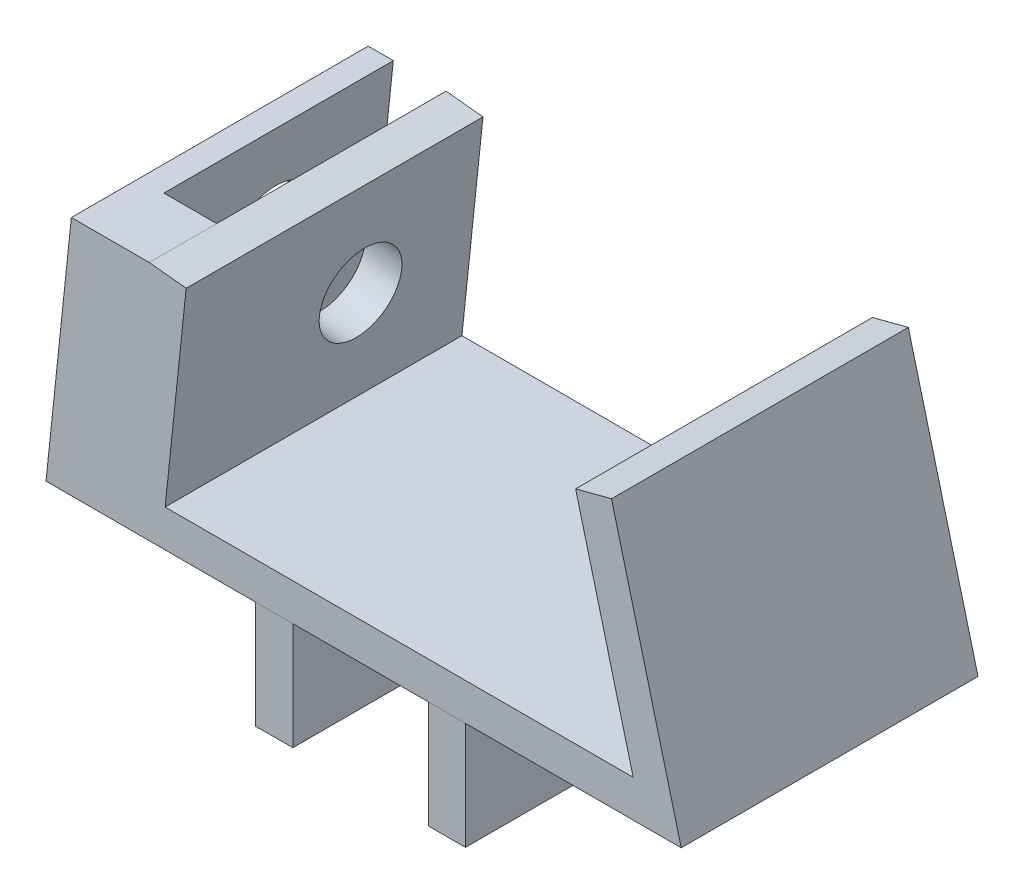
ISO-10303-21;
HEADER;
FILE_DESCRIPTION(('STEP AP214'),'2;1');
FILE_NAME('part.step','',(''),(''),'','','');
FILE_SCHEMA(('AUTOMOTIVE_DESIGN { 1 0 10303 214 1 1 1 1 }'));
ENDSEC;
DATA;
#1=APPLICATION_CONTEXT('core data for automotive mechanical design processes');
#2=APPLICATION_PROTOCOL_DEFINITION('international standard','automotive_design',2000,#1);
#3=PRODUCT_CONTEXT('',#1,'mechanical');
#4=PRODUCT('Part','Part','',(#3));
#5=PRODUCT_RELATED_PRODUCT_CATEGORY('part','',(#4));
#6=PRODUCT_DEFINITION_FORMATION('','',#4);
#7=PRODUCT_DEFINITION_CONTEXT('part definition',#1,'design');
#8=PRODUCT_DEFINITION('design','',#6,#7);
#9=PRODUCT_DEFINITION_SHAPE('','',#8);
#10=(LENGTH_UNIT() NAMED_UNIT(*) SI_UNIT(.MILLI.,.METRE.));
#11=(NAMED_UNIT(*) PLANE_ANGLE_UNIT() SI_UNIT($,.RADIAN.));
#12=(NAMED_UNIT(*) SI_UNIT($,.STERADIAN.) SOLID_ANGLE_UNIT());
#13=UNCERTAINTY_MEASURE_WITH_UNIT(LENGTH_MEASURE(1.E-05),#10,'distance_accuracy_value','');
#14=(GEOMETRIC_REPRESENTATION_CONTEXT(3) GLOBAL_UNCERTAINTY_ASSIGNED_CONTEXT((#13)) GLOBAL_UNIT_ASSIGNED_CONTEXT((#10,
#11,#12)) REPRESENTATION_CONTEXT('',''));
#15=CARTESIAN_POINT('',(0.,0.,0.));
#16=DIRECTION('',(0.,0.,1.));
#17=DIRECTION('',(1.,0.,0.));
#18=AXIS2_PLACEMENT_3D('',#15,#16,#17);
#19=CARTESIAN_POINT('',(9.48208303651341,3.49920908908251,80.));
#20=DIRECTION('',(1.,0.,0.));
#21=DIRECTION('',(0.,0.,-1.));
#22=AXIS2_PLACEMENT_3D('',#19,#20,#21);
#23=PLANE('',#22);
#24=DIRECTION('',(0.,1.,0.));
#25=VECTOR('',#24,1.);
#26=CARTESIAN_POINT('',(9.48208303651341,3.49920908908251,0.));
#27=LINE('',#26,#25);
#28=CARTESIAN_POINT('',(9.48208303651341,3.49920908908251,0.));
#29=VERTEX_POINT('',#28);
#30=CARTESIAN_POINT('',(9.48208303651341,-35.4649569839443,0.));
#31=VERTEX_POINT('',#30);
#32=EDGE_CURVE('E183',#29,#31,#27,.F.);
#33=ORIENTED_EDGE('',*,*,#32,.T.);
#34=DIRECTION('',(0.,0.,-1.));
#35=VECTOR('',#34,1.);
#36=CARTESIAN_POINT('',(9.48208303651341,-35.4649569839443,80.));
#37=LINE('',#36,#35);
#38=CARTESIAN_POINT('',(9.48208303651341,-35.4649569839443,80.));
#39=VERTEX_POINT('',#38);
#40=EDGE_CURVE('E13',#39,#31,#37,.T.);
#41=ORIENTED_EDGE('',*,*,#40,.F.);
#42=DIRECTION('',(0.,1.,0.));
#43=VECTOR('',#42,1.);
#44=CARTESIAN_POINT('',(9.48208303651341,3.49920908908251,80.));
#45=LINE('',#44,#43);
#46=CARTESIAN_POINT('',(9.48208303651341,3.49920908908251,80.));
#47=VERTEX_POINT('',#46);
#48=EDGE_CURVE('E160',#47,#39,#45,.F.);
#49=ORIENTED_EDGE('',*,*,#48,.F.);
#50=DIRECTION('',(0.,0.,-1.));
#51=VECTOR('',#50,1.);
#52=CARTESIAN_POINT('',(9.48208303651341,3.49920908908251,80.));
#53=LINE('',#52,#51);
#54=EDGE_CURVE('E136',#47,#29,#53,.T.);
#55=ORIENTED_EDGE('',*,*,#54,.T.);
#56=EDGE_LOOP('',(#33,#41,#49,#55));
#57=FACE_BOUND('',#56,.T.);
#58=ADVANCED_FACE('F120',(#57),#23,.F.);
#59=CARTESIAN_POINT('',(19.4820830365134,-35.4649569839443,80.));
#60=DIRECTION('',(0.,-1.,0.));
#61=DIRECTION('',(0.,0.,-1.));
#62=AXIS2_PLACEMENT_3D('',#59,#60,#61);
#63=PLANE('',#62);
#64=DIRECTION('',(-1.,0.,0.));
#65=VECTOR('',#64,1.);
#66=CARTESIAN_POINT('',(19.4820830365134,-35.4649569839443,0.));
#67=LINE('',#66,#65);
#68=CARTESIAN_POINT('',(19.4820830365134,-35.4649569839443,0.));
#69=VERTEX_POINT('',#68);
#70=EDGE_CURVE('E169',#69,#31,#67,.T.);
#71=ORIENTED_EDGE('',*,*,#70,.F.);
#72=DIRECTION('',(0.,0.,-1.));
#73=VECTOR('',#72,1.);
#74=CARTESIAN_POINT('',(19.4820830365134,-35.4649569839443,80.));
#75=LINE('',#74,#73);
#76=CARTESIAN_POINT('',(19.4820830365134,-35.4649569839443,80.));
#77=VERTEX_POINT('',#76);
#78=EDGE_CURVE('E128',#77,#69,#75,.T.);
#79=ORIENTED_EDGE('',*,*,#78,.F.);
#80=DIRECTION('',(-1.,0.,0.));
#81=VECTOR('',#80,1.);
#82=CARTESIAN_POINT('',(19.4820830365134,-35.4649569839443,80.));
#83=LINE('',#82,#81);
#84=EDGE_CURVE('E167',#77,#39,#83,.T.);
#85=ORIENTED_EDGE('',*,*,#84,.T.);
#86=ORIENTED_EDGE('',*,*,#40,.T.);
#87=EDGE_LOOP('',(#71,#79,#85,#86));
#88=FACE_BOUND('',#87,.T.);
#89=ADVANCED_FACE('F166',(#88),#63,.T.);
#90=CARTESIAN_POINT('',(19.4820830365134,3.49920908908251,80.));
#91=DIRECTION('',(1.,0.,0.));
#92=DIRECTION('',(0.,0.,-1.));
#93=AXIS2_PLACEMENT_3D('',#90,#91,#92);
#94=PLANE('',#93);
#95=DIRECTION('',(0.,-1.,0.));
#96=VECTOR('',#95,1.);
#97=CARTESIAN_POINT('',(19.4820830365134,3.49920908908251,0.));
#98=LINE('',#97,#96);
#99=CARTESIAN_POINT('',(19.4820830365134,3.49920908908251,0.));
#100=VERTEX_POINT('',#99);
#101=EDGE_CURVE('E186',#100,#69,#98,.T.);
#102=ORIENTED_EDGE('',*,*,#101,.F.);
#103=DIRECTION('',(0.,0.,-1.));
#104=VECTOR('',#103,1.);
#105=CARTESIAN_POINT('',(19.4820830365134,3.49920908908251,80.));
#106=LINE('',#105,#104);
#107=CARTESIAN_POINT('',(19.4820830365134,3.49920908908251,80.));
#108=VERTEX_POINT('',#107);
#109=EDGE_CURVE('E149',#108,#100,#106,.T.);
#110=ORIENTED_EDGE('',*,*,#109,.F.);
#111=DIRECTION('',(0.,-1.,0.));
#112=VECTOR('',#111,1.);
#113=CARTESIAN_POINT('',(19.4820830365134,3.49920908908251,80.));
#114=LINE('',#113,#112);
#115=EDGE_CURVE('E175',#108,#77,#114,.T.);
#116=ORIENTED_EDGE('',*,*,#115,.T.);
#117=ORIENTED_EDGE('',*,*,#78,.T.);
#118=EDGE_LOOP('',(#102,#110,#116,#117));
#119=FACE_BOUND('',#118,.T.);
#120=ADVANCED_FACE('F177',(#119),#94,.T.);
#121=CARTESIAN_POINT('',(9.48208303651341,3.49920908908251,80.));
#122=DIRECTION('',(0.,1.,0.));
#123=DIRECTION('',(0.,0.,1.));
#124=AXIS2_PLACEMENT_3D('',#121,#122,#123);
#125=PLANE('',#124);
#126=DIRECTION('',(1.,0.,0.));
#127=VECTOR('',#126,1.);
#128=CARTESIAN_POINT('',(9.48208303651341,3.49920908908251,0.));
#129=LINE('',#128,#127);
#130=EDGE_CURVE('E188',#29,#100,#129,.T.);
#131=ORIENTED_EDGE('',*,*,#130,.F.);
#132=ORIENTED_EDGE('',*,*,#54,.F.);
#133=DIRECTION('',(1.,0.,0.));
#134=VECTOR('',#133,1.);
#135=CARTESIAN_POINT('',(9.48208303651341,3.49920908908251,80.));
#136=LINE('',#135,#134);
#137=EDGE_CURVE('E178',#47,#108,#136,.T.);
#138=ORIENTED_EDGE('',*,*,#137,.T.);
#139=ORIENTED_EDGE('',*,*,#109,.T.);
#140=EDGE_LOOP('',(#131,#132,#138,#139));
#141=FACE_BOUND('',#140,.T.);
#142=ADVANCED_FACE('F194',(#141),#125,.T.);
#143=CARTESIAN_POINT('',(0.,0.,80.));
#144=DIRECTION('',(0.,0.,1.));
#145=DIRECTION('',(1.,0.,0.));
#146=AXIS2_PLACEMENT_3D('',#143,#144,#145);
#147=PLANE('',#146);
#148=ORIENTED_EDGE('',*,*,#48,.T.);
#149=ORIENTED_EDGE('',*,*,#84,.F.);
#150=ORIENTED_EDGE('',*,*,#115,.F.);
#151=ORIENTED_EDGE('',*,*,#137,.F.);
#152=EDGE_LOOP('',(#148,#149,#150,#151));
#153=FACE_BOUND('',#152,.T.);
#154=ADVANCED_FACE('F174',(#153),#147,.T.);
#155=CARTESIAN_POINT('',(0.,0.,0.));
#156=DIRECTION('',(0.,0.,1.));
#157=DIRECTION('',(1.,0.,0.));
#158=AXIS2_PLACEMENT_3D('',#155,#156,#157);
#159=PLANE('',#158);
#160=ORIENTED_EDGE('',*,*,#32,.F.);
#161=ORIENTED_EDGE('',*,*,#130,.T.);
#162=ORIENTED_EDGE('',*,*,#101,.T.);
#163=ORIENTED_EDGE('',*,*,#70,.T.);
#164=EDGE_LOOP('',(#160,#161,#162,#163));
#165=FACE_BOUND('',#164,.T.);
#166=ADVANCED_FACE('F193',(#165),#159,.F.);
#167=CLOSED_SHELL('',(#58,#89,#120,#142,#154,#166));
#168=MANIFOLD_SOLID_BREP('B2',#167);
#169=CARTESIAN_POINT('',(-37.0479405264215,3.49920908908251,80.));
#170=DIRECTION('',(1.,0.,0.));
#171=DIRECTION('',(0.,0.,-1.));
#172=AXIS2_PLACEMENT_3D('',#169,#170,#171);
#173=PLANE('',#172);
#174=DIRECTION('',(0.,1.,0.));
#175=VECTOR('',#174,1.);
#176=CARTESIAN_POINT('',(-37.0479405264215,3.49920908908251,0.));
#177=LINE('',#176,#175);
#178=CARTESIAN_POINT('',(-37.0479405264215,3.49920908908251,0.));
#179=VERTEX_POINT('',#178);
#180=CARTESIAN_POINT('',(-37.0479405264215,-35.4649569839443,0.));
#181=VERTEX_POINT('',#180);
#182=EDGE_CURVE('E316',#179,#181,#177,.F.);
#183=ORIENTED_EDGE('',*,*,#182,.T.);
#184=DIRECTION('',(0.,0.,-1.));
#185=VECTOR('',#184,1.);
#186=CARTESIAN_POINT('',(-37.0479405264215,-35.4649569839443,80.));
#187=LINE('',#186,#185);
#188=CARTESIAN_POINT('',(-37.0479405264215,-35.4649569839443,80.));
#189=VERTEX_POINT('',#188);
#190=EDGE_CURVE('E118',#189,#181,#187,.T.);
#191=ORIENTED_EDGE('',*,*,#190,.F.);
#192=DIRECTION('',(0.,1.,0.));
#193=VECTOR('',#192,1.);
#194=CARTESIAN_POINT('',(-37.0479405264215,3.49920908908251,80.));
#195=LINE('',#194,#193);
#196=CARTESIAN_POINT('',(-37.0479405264215,3.49920908908251,80.));
#197=VERTEX_POINT('',#196);
#198=EDGE_CURVE('E293',#197,#189,#195,.F.);
#199=ORIENTED_EDGE('',*,*,#198,.F.);
#200=DIRECTION('',(0.,0.,-1.));
#201=VECTOR('',#200,1.);
#202=CARTESIAN_POINT('',(-37.0479405264215,3.49920908908251,80.));
#203=LINE('',#202,#201);
#204=EDGE_CURVE('E269',#197,#179,#203,.T.);
#205=ORIENTED_EDGE('',*,*,#204,.T.);
#206=EDGE_LOOP('',(#183,#191,#199,#205));
#207=FACE_BOUND('',#206,.T.);
#208=ADVANCED_FACE('F253',(#207),#173,.F.);
#209=CARTESIAN_POINT('',(-27.0479405264215,-35.4649569839443,80.));
#210=DIRECTION('',(0.,-1.,0.));
#211=DIRECTION('',(0.,0.,-1.));
#212=AXIS2_PLACEMENT_3D('',#209,#210,#211);
#213=PLANE('',#212);
#214=DIRECTION('',(-1.,0.,0.));
#215=VECTOR('',#214,1.);
#216=CARTESIAN_POINT('',(-27.0479405264215,-35.4649569839443,0.));
#217=LINE('',#216,#215);
#218=CARTESIAN_POINT('',(-27.0479405264215,-35.4649569839443,0.));
#219=VERTEX_POINT('',#218);
#220=EDGE_CURVE('E302',#219,#181,#217,.T.);
#221=ORIENTED_EDGE('',*,*,#220,.F.);
#222=DIRECTION('',(0.,0.,-1.));
#223=VECTOR('',#222,1.);
#224=CARTESIAN_POINT('',(-27.0479405264215,-35.4649569839443,80.));
#225=LINE('',#224,#223);
#226=CARTESIAN_POINT('',(-27.0479405264215,-35.4649569839443,80.));
#227=VERTEX_POINT('',#226);
#228=EDGE_CURVE('E261',#227,#219,#225,.T.);
#229=ORIENTED_EDGE('',*,*,#228,.F.);
#230=DIRECTION('',(-1.,0.,0.));
#231=VECTOR('',#230,1.);
#232=CARTESIAN_POINT('',(-27.0479405264215,-35.4649569839443,80.));
#233=LINE('',#232,#231);
#234=EDGE_CURVE('E300',#227,#189,#233,.T.);
#235=ORIENTED_EDGE('',*,*,#234,.T.);
#236=ORIENTED_EDGE('',*,*,#190,.T.);
#237=EDGE_LOOP('',(#221,#229,#235,#236));
#238=FACE_BOUND('',#237,.T.);
#239=ADVANCED_FACE('F299',(#238),#213,.T.);
#240=CARTESIAN_POINT('',(-27.0479405264215,3.49920908908251,80.));
#241=DIRECTION('',(1.,0.,0.));
#242=DIRECTION('',(0.,0.,-1.));
#243=AXIS2_PLACEMENT_3D('',#240,#241,#242);
#244=PLANE('',#243);
#245=DIRECTION('',(0.,-1.,0.));
#246=VECTOR('',#245,1.);
#247=CARTESIAN_POINT('',(-27.0479405264215,3.49920908908251,0.));
#248=LINE('',#247,#246);
#249=CARTESIAN_POINT('',(-27.0479405264215,3.49920908908251,0.));
#250=VERTEX_POINT('',#249);
#251=EDGE_CURVE('E319',#250,#219,#248,.T.);
#252=ORIENTED_EDGE('',*,*,#251,.F.);
#253=DIRECTION('',(0.,0.,-1.));
#254=VECTOR('',#253,1.);
#255=CARTESIAN_POINT('',(-27.0479405264215,3.49920908908251,80.));
#256=LINE('',#255,#254);
#257=CARTESIAN_POINT('',(-27.0479405264215,3.49920908908251,80.));
#258=VERTEX_POINT('',#257);
#259=EDGE_CURVE('E282',#258,#250,#256,.T.);
#260=ORIENTED_EDGE('',*,*,#259,.F.);
#261=DIRECTION('',(0.,-1.,0.));
#262=VECTOR('',#261,1.);
#263=CARTESIAN_POINT('',(-27.0479405264215,3.49920908908251,80.));
#264=LINE('',#263,#262);
#265=EDGE_CURVE('E308',#258,#227,#264,.T.);
#266=ORIENTED_EDGE('',*,*,#265,.T.);
#267=ORIENTED_EDGE('',*,*,#228,.T.);
#268=EDGE_LOOP('',(#252,#260,#266,#267));
#269=FACE_BOUND('',#268,.T.);
#270=ADVANCED_FACE('F310',(#269),#244,.T.);
#271=CARTESIAN_POINT('',(-37.0479405264215,3.49920908908251,80.));
#272=DIRECTION('',(0.,1.,0.));
#273=DIRECTION('',(0.,0.,1.));
#274=AXIS2_PLACEMENT_3D('',#271,#272,#273);
#275=PLANE('',#274);
#276=DIRECTION('',(1.,0.,0.));
#277=VECTOR('',#276,1.);
#278=CARTESIAN_POINT('',(-37.0479405264215,3.49920908908251,0.));
#279=LINE('',#278,#277);
#280=EDGE_CURVE('E321',#179,#250,#279,.T.);
#281=ORIENTED_EDGE('',*,*,#280,.F.);
#282=ORIENTED_EDGE('',*,*,#204,.F.);
#283=DIRECTION('',(1.,0.,0.));
#284=VECTOR('',#283,1.);
#285=CARTESIAN_POINT('',(-37.0479405264215,3.49920908908251,80.));
#286=LINE('',#285,#284);
#287=EDGE_CURVE('E311',#197,#258,#286,.T.);
#288=ORIENTED_EDGE('',*,*,#287,.T.);
#289=ORIENTED_EDGE('',*,*,#259,.T.);
#290=EDGE_LOOP('',(#281,#282,#288,#289));
#291=FACE_BOUND('',#290,.T.);
#292=ADVANCED_FACE('F327',(#291),#275,.T.);
#293=CARTESIAN_POINT('',(0.,0.,80.));
#294=DIRECTION('',(0.,0.,1.));
#295=DIRECTION('',(1.,0.,0.));
#296=AXIS2_PLACEMENT_3D('',#293,#294,#295);
#297=PLANE('',#296);
#298=ORIENTED_EDGE('',*,*,#198,.T.);
#299=ORIENTED_EDGE('',*,*,#234,.F.);
#300=ORIENTED_EDGE('',*,*,#265,.F.);
#301=ORIENTED_EDGE('',*,*,#287,.F.);
#302=EDGE_LOOP('',(#298,#299,#300,#301));
#303=FACE_BOUND('',#302,.T.);
#304=ADVANCED_FACE('F307',(#303),#297,.T.);
#305=CARTESIAN_POINT('',(0.,0.,0.));
#306=DIRECTION('',(0.,0.,1.));
#307=DIRECTION('',(1.,0.,0.));
#308=AXIS2_PLACEMENT_3D('',#305,#306,#307);
#309=PLANE('',#308);
#310=ORIENTED_EDGE('',*,*,#182,.F.);
#311=ORIENTED_EDGE('',*,*,#280,.T.);
#312=ORIENTED_EDGE('',*,*,#251,.T.);
#313=ORIENTED_EDGE('',*,*,#220,.T.);
#314=EDGE_LOOP('',(#310,#311,#312,#313));
#315=FACE_BOUND('',#314,.T.);
#316=ADVANCED_FACE('F326',(#315),#309,.F.);
#317=CLOSED_SHELL('',(#208,#239,#270,#292,#304,#316));
#318=MANIFOLD_SOLID_BREP('B7',#317);
#319=CARTESIAN_POINT('',(-86.7432535172865,58.4527915498583,61.8222259921455));
#320=DIRECTION('',(0.,0.,-1.));
#321=DIRECTION('',(-1.,0.,0.));
#322=AXIS2_PLACEMENT_3D('',#319,#320,#321);
#323=PLANE('',#322);
#324=DIRECTION('',(1.,0.,0.));
#325=VECTOR('',#324,1.);
#326=CARTESIAN_POINT('',(-93.5804727236839,-6.50079091091751,61.8222259921455));
#327=LINE('',#326,#325);
#328=CARTESIAN_POINT('',(-86.8136627150265,-6.50079091091751,61.8222259921455));
#329=VERTEX_POINT('',#328);
#330=CARTESIAN_POINT('',(-72.5804727236839,-6.50079091091751,61.8222259921455));
#331=VERTEX_POINT('',#330);
#332=EDGE_CURVE('E398',#329,#331,#327,.T.);
#333=ORIENTED_EDGE('',*,*,#332,.F.);
#334=DIRECTION('',(-0.104684784518043,-0.994505452921406,0.));
#335=VECTOR('',#334,1.);
#336=CARTESIAN_POINT('',(-86.8136627150265,-6.50079091091751,61.8222259921455));
#337=LINE('',#336,#335);
#338=CARTESIAN_POINT('',(-79.976443508629,58.4527915498583,61.8222259921455));
#339=VERTEX_POINT('',#338);
#340=EDGE_CURVE('E393',#339,#329,#337,.T.);
#341=ORIENTED_EDGE('',*,*,#340,.F.);
#342=DIRECTION('',(1.,0.,0.));
#343=VECTOR('',#342,1.);
#344=CARTESIAN_POINT('',(-86.7432535172865,58.4527915498583,61.8222259921455));
#345=LINE('',#344,#343);
#346=CARTESIAN_POINT('',(-65.7432535172865,58.4527915498583,61.8222259921455));
#347=VERTEX_POINT('',#346);
#348=EDGE_CURVE('E511',#339,#347,#345,.T.);
#349=ORIENTED_EDGE('',*,*,#348,.T.);
#350=DIRECTION('',(0.104684784518043,0.994505452921406,0.));
#351=VECTOR('',#350,1.);
#352=CARTESIAN_POINT('',(-65.7432535172865,58.4527915498583,61.8222259921455));
#353=LINE('',#352,#351);
#354=EDGE_CURVE('E489',#331,#347,#353,.T.);
#355=ORIENTED_EDGE('',*,*,#354,.F.);
#356=EDGE_LOOP('',(#333,#341,#349,#355));
#357=FACE_BOUND('',#356,.T.);
#358=ADVANCED_FACE('F377',(#357),#323,.T.);
#359=CARTESIAN_POINT('',(74.3655579811071,6.01842517884823,80.));
#360=DIRECTION('',(-0.967747644239269,-0.251921608976572,0.));
#361=DIRECTION('',(0.251921608976572,-0.967747644239269,0.));
#362=AXIS2_PLACEMENT_3D('',#359,#360,#361);
#363=PLANE('',#362);
#364=DIRECTION('',(-0.251921608976572,0.967747644239269,0.));
#365=VECTOR('',#364,1.);
#366=CARTESIAN_POINT('',(74.3655579811071,6.01842517884823,0.));
#367=LINE('',#366,#365);
#368=CARTESIAN_POINT('',(77.6245285187605,-6.50079091091749,0.));
#369=VERTEX_POINT('',#368);
#370=CARTESIAN_POINT('',(58.8555501267955,65.5995529118747,0.));
#371=VERTEX_POINT('',#370);
#372=EDGE_CURVE('E510',#369,#371,#367,.T.);
#373=ORIENTED_EDGE('',*,*,#372,.T.);
#374=DIRECTION('',(0.,0.,-1.));
#375=VECTOR('',#374,1.);
#376=CARTESIAN_POINT('',(58.8555501267955,65.5995529118747,80.));
#377=LINE('',#376,#375);
#378=CARTESIAN_POINT('',(58.8555501267955,65.5995529118747,80.));
#379=VERTEX_POINT('',#378);
#380=EDGE_CURVE('E251',#379,#371,#377,.T.);
#381=ORIENTED_EDGE('',*,*,#380,.F.);
#382=DIRECTION('',(-0.251921608976572,0.967747644239269,0.));
#383=VECTOR('',#382,1.);
#384=CARTESIAN_POINT('',(74.3655579811071,6.01842517884823,80.));
#385=LINE('',#384,#383);
#386=CARTESIAN_POINT('',(77.6245285187605,-6.50079091091749,80.));
#387=VERTEX_POINT('',#386);
#388=EDGE_CURVE('E514',#387,#379,#385,.T.);
#389=ORIENTED_EDGE('',*,*,#388,.F.);
#390=DIRECTION('',(0.,0.,-1.));
#391=VECTOR('',#390,1.);
#392=CARTESIAN_POINT('',(77.6245285187605,-6.50079091091749,80.));
#393=LINE('',#392,#391);
#394=EDGE_CURVE('E534',#387,#369,#393,.T.);
#395=ORIENTED_EDGE('',*,*,#394,.T.);
#396=EDGE_LOOP('',(#373,#381,#389,#395));
#397=FACE_BOUND('',#396,.T.);
#398=ADVANCED_FACE('F379',(#397),#363,.F.);
#399=CARTESIAN_POINT('',(49.1780736844028,63.080336822109,80.));
#400=DIRECTION('',(-0.251921608976573,0.967747644239269,0.));
#401=DIRECTION('',(-0.967747644239269,-0.251921608976573,0.));
#402=AXIS2_PLACEMENT_3D('',#399,#400,#401);
#403=PLANE('',#402);
#404=DIRECTION('',(0.967747644239269,0.251921608976573,0.));
#405=VECTOR('',#404,1.);
#406=CARTESIAN_POINT('',(49.1780736844028,63.080336822109,0.));
#407=LINE('',#406,#405);
#408=CARTESIAN_POINT('',(49.1780736844028,63.080336822109,0.));
#409=VERTEX_POINT('',#408);
#410=EDGE_CURVE('E537',#409,#371,#407,.T.);
#411=ORIENTED_EDGE('',*,*,#410,.F.);
#412=DIRECTION('',(0.,0.,-1.));
#413=VECTOR('',#412,1.);
#414=CARTESIAN_POINT('',(49.1780736844028,63.080336822109,80.));
#415=LINE('',#414,#413);
#416=CARTESIAN_POINT('',(49.1780736844028,63.080336822109,80.));
#417=VERTEX_POINT('',#416);
#418=EDGE_CURVE('E386',#417,#409,#415,.T.);
#419=ORIENTED_EDGE('',*,*,#418,.F.);
#420=DIRECTION('',(0.967747644239269,0.251921608976573,0.));
#421=VECTOR('',#420,1.);
#422=CARTESIAN_POINT('',(49.1780736844028,63.080336822109,80.));
#423=LINE('',#422,#421);
#424=EDGE_CURVE('E516',#417,#379,#423,.T.);
#425=ORIENTED_EDGE('',*,*,#424,.T.);
#426=ORIENTED_EDGE('',*,*,#380,.T.);
#427=EDGE_LOOP('',(#411,#419,#425,#426));
#428=FACE_BOUND('',#427,.T.);
#429=ADVANCED_FACE('F577',(#428),#403,.T.);
#430=CARTESIAN_POINT('',(64.6880815387144,3.49920908908251,80.));
#431=DIRECTION('',(-0.967747644239269,-0.251921608976572,0.));
#432=DIRECTION('',(0.251921608976572,-0.967747644239269,0.));
#433=AXIS2_PLACEMENT_3D('',#430,#431,#432);
#434=PLANE('',#433);
#435=DIRECTION('',(-0.251921608976572,0.967747644239269,0.));
#436=VECTOR('',#435,1.);
#437=CARTESIAN_POINT('',(64.6880815387144,3.49920908908251,0.));
#438=LINE('',#437,#436);
#439=CARTESIAN_POINT('',(64.6880815387144,3.49920908908251,0.));
#440=VERTEX_POINT('',#439);
#441=EDGE_CURVE('E540',#440,#409,#438,.T.);
#442=ORIENTED_EDGE('',*,*,#441,.F.);
#443=DIRECTION('',(0.,0.,-1.));
#444=VECTOR('',#443,1.);
#445=CARTESIAN_POINT('',(64.6880815387144,3.49920908908251,80.));
#446=LINE('',#445,#444);
#447=CARTESIAN_POINT('',(64.6880815387144,3.49920908908251,80.));
#448=VERTEX_POINT('',#447);
#449=EDGE_CURVE('E568',#448,#440,#446,.T.);
#450=ORIENTED_EDGE('',*,*,#449,.F.);
#451=DIRECTION('',(-0.251921608976572,0.967747644239269,0.));
#452=VECTOR('',#451,1.);
#453=CARTESIAN_POINT('',(64.6880815387144,3.49920908908251,80.));
#454=LINE('',#453,#452);
#455=EDGE_CURVE('E520',#448,#417,#454,.T.);
#456=ORIENTED_EDGE('',*,*,#455,.T.);
#457=ORIENTED_EDGE('',*,*,#418,.T.);
#458=EDGE_LOOP('',(#442,#450,#456,#457));
#459=FACE_BOUND('',#458,.T.);
#460=ADVANCED_FACE('F573',(#459),#434,.T.);
#461=CARTESIAN_POINT('',(-61.4725921055035,3.49920908908251,80.));
#462=DIRECTION('',(0.,1.,0.));
#463=DIRECTION('',(0.,0.,1.));
#464=AXIS2_PLACEMENT_3D('',#461,#462,#463);
#465=PLANE('',#464);
#466=DIRECTION('',(1.,0.,0.));
#467=VECTOR('',#466,1.);
#468=CARTESIAN_POINT('',(-61.4725921055035,3.49920908908251,0.));
#469=LINE('',#468,#467);
#470=CARTESIAN_POINT('',(-61.4725921055035,3.49920908908251,0.));
#471=VERTEX_POINT('',#470);
#472=EDGE_CURVE('E543',#471,#440,#469,.T.);
#473=ORIENTED_EDGE('',*,*,#472,.F.);
#474=DIRECTION('',(0.,0.,-1.));
#475=VECTOR('',#474,1.);
#476=CARTESIAN_POINT('',(-61.4725921055035,3.49920908908251,80.));
#477=LINE('',#476,#475);
#478=CARTESIAN_POINT('',(-61.4725921055035,3.49920908908251,80.));
#479=VERTEX_POINT('',#478);
#480=EDGE_CURVE('E566',#479,#471,#477,.T.);
#481=ORIENTED_EDGE('',*,*,#480,.F.);
#482=DIRECTION('',(1.,0.,0.));
#483=VECTOR('',#482,1.);
#484=CARTESIAN_POINT('',(-61.4725921055035,3.49920908908251,80.));
#485=LINE('',#484,#483);
#486=EDGE_CURVE('E523',#479,#448,#485,.T.);
#487=ORIENTED_EDGE('',*,*,#486,.T.);
#488=ORIENTED_EDGE('',*,*,#449,.T.);
#489=EDGE_LOOP('',(#473,#481,#487,#488));
#490=FACE_BOUND('',#489,.T.);
#491=ADVANCED_FACE('F585',(#490),#465,.T.);
#492=CARTESIAN_POINT('',(-55.7981989880724,57.4059437046779,80.));
#493=DIRECTION('',(0.994505452921406,-0.104684784518043,0.));
#494=DIRECTION('',(0.104684784518043,0.994505452921406,0.));
#495=AXIS2_PLACEMENT_3D('',#492,#493,#494);
#496=PLANE('',#495);
#497=CARTESIAN_POINT('',(-58.6843277920406,29.98772006698,30.1213193870922));
#498=DIRECTION('',(0.994505452921406,-0.104684784518043,0.));
#499=DIRECTION('',(0.104684784518043,0.994505452921406,0.));
#500=AXIS2_PLACEMENT_3D('',#497,#498,#499);
#501=CIRCLE('',#500,11.1008518366628);
#502=CARTESIAN_POINT('',(-59.8464180745284,18.9478623833463,30.1213193870922));
#503=VERTEX_POINT('',#502);
#504=EDGE_CURVE('E500',#503,#503,#501,.T.);
#505=ORIENTED_EDGE('',*,*,#504,.F.);
#506=EDGE_LOOP('',(#505));
#507=FACE_BOUND('',#506,.T.);
#508=DIRECTION('',(-0.104684784518043,-0.994505452921406,0.));
#509=VECTOR('',#508,1.);
#510=CARTESIAN_POINT('',(-55.7981989880724,57.4059437046779,0.));
#511=LINE('',#510,#509);
#512=CARTESIAN_POINT('',(-55.7981989880724,57.4059437046779,0.));
#513=VERTEX_POINT('',#512);
#514=EDGE_CURVE('E546',#513,#471,#511,.T.);
#515=ORIENTED_EDGE('',*,*,#514,.F.);
#516=DIRECTION('',(0.,0.,-1.));
#517=VECTOR('',#516,1.);
#518=CARTESIAN_POINT('',(-55.7981989880724,57.4059437046779,80.));
#519=LINE('',#518,#517);
#520=CARTESIAN_POINT('',(-55.7981989880724,57.4059437046779,80.));
#521=VERTEX_POINT('',#520);
#522=EDGE_CURVE('E564',#521,#513,#519,.T.);
#523=ORIENTED_EDGE('',*,*,#522,.F.);
#524=DIRECTION('',(-0.104684784518043,-0.994505452921406,0.));
#525=VECTOR('',#524,1.);
#526=CARTESIAN_POINT('',(-55.7981989880724,57.4059437046779,80.));
#527=LINE('',#526,#525);
#528=EDGE_CURVE('E526',#521,#479,#527,.T.);
#529=ORIENTED_EDGE('',*,*,#528,.T.);
#530=ORIENTED_EDGE('',*,*,#480,.T.);
#531=EDGE_LOOP('',(#515,#523,#529,#530));
#532=FACE_BOUND('',#531,.T.);
#533=ADVANCED_FACE('F605',(#507,#532),#496,.T.);
#534=CARTESIAN_POINT('',(-65.7432535172865,58.4527915498583,80.));
#535=DIRECTION('',(0.104684784518043,0.994505452921406,0.));
#536=DIRECTION('',(-0.994505452921406,0.104684784518043,0.));
#537=AXIS2_PLACEMENT_3D('',#534,#535,#536);
#538=PLANE('',#537);
#539=DIRECTION('',(0.994505452921406,-0.104684784518043,0.));
#540=VECTOR('',#539,1.);
#541=CARTESIAN_POINT('',(-65.7432535172865,58.4527915498583,0.));
#542=LINE('',#541,#540);
#543=CARTESIAN_POINT('',(-65.7432535172865,58.4527915498583,0.));
#544=VERTEX_POINT('',#543);
#545=EDGE_CURVE('E549',#544,#513,#542,.T.);
#546=ORIENTED_EDGE('',*,*,#545,.F.);
#547=DIRECTION('',(0.,0.,-1.));
#548=VECTOR('',#547,1.);
#549=CARTESIAN_POINT('',(-65.7432535172865,58.4527915498583,80.));
#550=LINE('',#549,#548);
#551=EDGE_CURVE('E560',#347,#544,#550,.T.);
#552=ORIENTED_EDGE('',*,*,#551,.F.);
#553=CARTESIAN_POINT('',(-65.7432535172865,58.4527915498583,80.));
#554=VERTEX_POINT('',#553);
#555=EDGE_CURVE('E561',#554,#347,#550,.T.);
#556=ORIENTED_EDGE('',*,*,#555,.F.);
#557=DIRECTION('',(0.994505452921406,-0.104684784518043,0.));
#558=VECTOR('',#557,1.);
#559=CARTESIAN_POINT('',(-65.7432535172865,58.4527915498583,80.));
#560=LINE('',#559,#558);
#561=EDGE_CURVE('E529',#554,#521,#560,.T.);
#562=ORIENTED_EDGE('',*,*,#561,.T.);
#563=ORIENTED_EDGE('',*,*,#522,.T.);
#564=EDGE_LOOP('',(#546,#552,#556,#562,#563));
#565=FACE_BOUND('',#564,.T.);
#566=ADVANCED_FACE('F602',(#565),#538,.T.);
#567=CARTESIAN_POINT('',(-65.7432535172865,58.4527915498583,80.));
#568=DIRECTION('',(0.994505452921406,-0.104684784518043,0.));
#569=DIRECTION('',(0.104684784518043,0.994505452921406,0.));
#570=AXIS2_PLACEMENT_3D('',#567,#568,#569);
#571=PLANE('',#570);
#572=CARTESIAN_POINT('',(-68.6293823212547,31.0345679121605,30.1213193870922));
#573=DIRECTION('',(0.994505452921406,-0.104684784518043,0.));
#574=DIRECTION('',(0.104684784518043,0.994505452921406,0.));
#575=AXIS2_PLACEMENT_3D('',#572,#573,#574);
#576=CIRCLE('',#575,11.1008518366628);
#577=CARTESIAN_POINT('',(-69.7914726037424,19.9947102285267,30.1213193870922));
#578=VERTEX_POINT('',#577);
#579=EDGE_CURVE('E772',#578,#578,#576,.T.);
#580=ORIENTED_EDGE('',*,*,#579,.T.);
#581=EDGE_LOOP('',(#580));
#582=FACE_BOUND('',#581,.T.);
#583=DIRECTION('',(0.,0.,-1.));
#584=VECTOR('',#583,1.);
#585=CARTESIAN_POINT('',(-72.5804727236839,-6.50079091091749,80.));
#586=LINE('',#585,#584);
#587=CARTESIAN_POINT('',(-72.5804727236839,-6.50079091091749,0.));
#588=VERTEX_POINT('',#587);
#589=EDGE_CURVE('E558',#331,#588,#586,.T.);
#590=ORIENTED_EDGE('',*,*,#589,.F.);
#591=ORIENTED_EDGE('',*,*,#354,.T.);
#592=ORIENTED_EDGE('',*,*,#551,.T.);
#593=DIRECTION('',(-0.104684784518043,-0.994505452921406,0.));
#594=VECTOR('',#593,1.);
#595=CARTESIAN_POINT('',(-65.7432535172865,58.4527915498583,0.));
#596=LINE('',#595,#594);
#597=EDGE_CURVE('E552',#544,#588,#596,.T.);
#598=ORIENTED_EDGE('',*,*,#597,.T.);
#599=EDGE_LOOP('',(#590,#591,#592,#598));
#600=FACE_BOUND('',#599,.T.);
#601=ADVANCED_FACE('F598',(#582,#600),#571,.F.);
#602=CARTESIAN_POINT('',(-61.4725921055035,-6.50079091091749,80.));
#603=DIRECTION('',(0.,1.,0.));
#604=DIRECTION('',(0.,0.,1.));
#605=AXIS2_PLACEMENT_3D('',#602,#603,#604);
#606=PLANE('',#605);
#607=DIRECTION('',(1.,0.,0.));
#608=VECTOR('',#607,1.);
#609=CARTESIAN_POINT('',(-61.4725921055035,-6.50079091091749,0.));
#610=LINE('',#609,#608);
#611=EDGE_CURVE('E517',#588,#369,#610,.T.);
#612=ORIENTED_EDGE('',*,*,#611,.T.);
#613=ORIENTED_EDGE('',*,*,#394,.F.);
#614=DIRECTION('',(1.,0.,0.));
#615=VECTOR('',#614,1.);
#616=CARTESIAN_POINT('',(-61.4725921055035,-6.50079091091749,80.));
#617=LINE('',#616,#615);
#618=CARTESIAN_POINT('',(-93.5804727236839,-6.50079091091749,80.));
#619=VERTEX_POINT('',#618);
#620=EDGE_CURVE('E532',#619,#387,#617,.T.);
#621=ORIENTED_EDGE('',*,*,#620,.F.);
#622=DIRECTION('',(0.,0.,-1.));
#623=VECTOR('',#622,1.);
#624=CARTESIAN_POINT('',(-93.5804727236839,-6.50079091091749,80.));
#625=LINE('',#624,#623);
#626=CARTESIAN_POINT('',(-93.5804727236839,-6.50079091091751,0.));
#627=VERTEX_POINT('',#626);
#628=EDGE_CURVE('E479',#619,#627,#625,.T.);
#629=ORIENTED_EDGE('',*,*,#628,.T.);
#630=DIRECTION('',(-1.,0.,0.));
#631=VECTOR('',#630,1.);
#632=CARTESIAN_POINT('',(-93.5804727236839,-6.50079091091751,0.));
#633=LINE('',#632,#631);
#634=CARTESIAN_POINT('',(-86.8136627150265,-6.50079091091751,0.));
#635=VERTEX_POINT('',#634);
#636=EDGE_CURVE('E474',#635,#627,#633,.T.);
#637=ORIENTED_EDGE('',*,*,#636,.F.);
#638=DIRECTION('',(0.,0.,1.));
#639=VECTOR('',#638,1.);
#640=CARTESIAN_POINT('',(-86.8136627150265,-6.50079091091751,-66.3629225198294));
#641=LINE('',#640,#639);
#642=EDGE_CURVE('E466',#635,#329,#641,.T.);
#643=ORIENTED_EDGE('',*,*,#642,.T.);
#644=ORIENTED_EDGE('',*,*,#332,.T.);
#645=ORIENTED_EDGE('',*,*,#589,.T.);
#646=EDGE_LOOP('',(#612,#613,#621,#629,#637,#643,#644,#645));
#647=FACE_BOUND('',#646,.T.);
#648=ADVANCED_FACE('F477',(#647),#606,.F.);
#649=CARTESIAN_POINT('',(0.,0.,80.));
#650=DIRECTION('',(0.,0.,-1.));
#651=DIRECTION('',(-1.,0.,0.));
#652=AXIS2_PLACEMENT_3D('',#649,#650,#651);
#653=PLANE('',#652);
#654=ORIENTED_EDGE('',*,*,#388,.T.);
#655=ORIENTED_EDGE('',*,*,#424,.F.);
#656=ORIENTED_EDGE('',*,*,#455,.F.);
#657=ORIENTED_EDGE('',*,*,#486,.F.);
#658=ORIENTED_EDGE('',*,*,#528,.F.);
#659=ORIENTED_EDGE('',*,*,#561,.F.);
#660=DIRECTION('',(1.,0.,0.));
#661=VECTOR('',#660,1.);
#662=CARTESIAN_POINT('',(-86.7432535172865,58.4527915498583,80.));
#663=LINE('',#662,#661);
#664=CARTESIAN_POINT('',(-86.7432535172865,58.4527915498583,80.));
#665=VERTEX_POINT('',#664);
#666=EDGE_CURVE('E508',#665,#554,#663,.T.);
#667=ORIENTED_EDGE('',*,*,#666,.F.);
#668=DIRECTION('',(-0.104684784518043,-0.994505452921406,0.));
#669=VECTOR('',#668,1.);
#670=CARTESIAN_POINT('',(-86.7432535172865,58.4527915498583,80.));
#671=LINE('',#670,#669);
#672=EDGE_CURVE('E492',#665,#619,#671,.T.);
#673=ORIENTED_EDGE('',*,*,#672,.T.);
#674=ORIENTED_EDGE('',*,*,#620,.T.);
#675=EDGE_LOOP('',(#654,#655,#656,#657,#658,#659,#667,#673,#674));
#676=FACE_BOUND('',#675,.T.);
#677=ADVANCED_FACE('F588',(#676),#653,.F.);
#678=CARTESIAN_POINT('',(0.,0.,0.));
#679=DIRECTION('',(0.,0.,-1.));
#680=DIRECTION('',(-1.,0.,0.));
#681=AXIS2_PLACEMENT_3D('',#678,#679,#680);
#682=PLANE('',#681);
#683=ORIENTED_EDGE('',*,*,#372,.F.);
#684=ORIENTED_EDGE('',*,*,#611,.F.);
#685=ORIENTED_EDGE('',*,*,#597,.F.);
#686=ORIENTED_EDGE('',*,*,#545,.T.);
#687=ORIENTED_EDGE('',*,*,#514,.T.);
#688=ORIENTED_EDGE('',*,*,#472,.T.);
#689=ORIENTED_EDGE('',*,*,#441,.T.);
#690=ORIENTED_EDGE('',*,*,#410,.T.);
#691=EDGE_LOOP('',(#683,#684,#685,#686,#687,#688,#689,#690));
#692=FACE_BOUND('',#691,.T.);
#693=ADVANCED_FACE('F581',(#692),#682,.T.);
#694=CARTESIAN_POINT('',(-86.7432535172865,58.4527915498583,80.));
#695=DIRECTION('',(0.,1.,0.));
#696=DIRECTION('',(0.,0.,1.));
#697=AXIS2_PLACEMENT_3D('',#694,#695,#696);
#698=PLANE('',#697);
#699=ORIENTED_EDGE('',*,*,#555,.T.);
#700=ORIENTED_EDGE('',*,*,#348,.F.);
#701=DIRECTION('',(0.,0.,1.));
#702=VECTOR('',#701,1.);
#703=CARTESIAN_POINT('',(-79.976443508629,58.4527915498583,-66.3629225198294));
#704=LINE('',#703,#702);
#705=CARTESIAN_POINT('',(-79.976443508629,58.4527915498583,0.));
#706=VERTEX_POINT('',#705);
#707=EDGE_CURVE('E499',#706,#339,#704,.T.);
#708=ORIENTED_EDGE('',*,*,#707,.F.);
#709=DIRECTION('',(1.,0.,0.));
#710=VECTOR('',#709,1.);
#711=CARTESIAN_POINT('',(-86.7432535172865,58.4527915498583,0.));
#712=LINE('',#711,#710);
#713=CARTESIAN_POINT('',(-86.7432535172865,58.4527915498583,0.));
#714=VERTEX_POINT('',#713);
#715=EDGE_CURVE('E488',#714,#706,#712,.T.);
#716=ORIENTED_EDGE('',*,*,#715,.F.);
#717=DIRECTION('',(0.,0.,1.));
#718=VECTOR('',#717,1.);
#719=CARTESIAN_POINT('',(-86.7432535172865,58.4527915498583,80.));
#720=LINE('',#719,#718);
#721=EDGE_CURVE('E505',#714,#665,#720,.T.);
#722=ORIENTED_EDGE('',*,*,#721,.T.);
#723=ORIENTED_EDGE('',*,*,#666,.T.);
#724=EDGE_LOOP('',(#699,#700,#708,#716,#722,#723));
#725=FACE_BOUND('',#724,.T.);
#726=ADVANCED_FACE('F610',(#725),#698,.T.);
#727=CARTESIAN_POINT('',(-92.1082756126988,7.48508164344197,0.));
#728=DIRECTION('',(0.994505452921406,-0.104684784518043,0.));
#729=DIRECTION('',(0.104684784518043,0.994505452921406,0.));
#730=AXIS2_PLACEMENT_3D('',#727,#728,#729);
#731=PLANE('',#730);
#732=CARTESIAN_POINT('',(-89.3992453349534,33.2208692820235,30.1213193870922));
#733=DIRECTION('',(-0.994505452921406,0.104684784518043,0.));
#734=DIRECTION('',(-0.104684784518043,-0.994505452921406,0.));
#735=AXIS2_PLACEMENT_3D('',#732,#733,#734);
#736=CIRCLE('',#735,11.1008518366628);
#737=CARTESIAN_POINT('',(-90.5613356174412,22.1810115983897,30.1213193870922));
#738=VERTEX_POINT('',#737);
#739=EDGE_CURVE('E775',#738,#738,#736,.T.);
#740=ORIENTED_EDGE('',*,*,#739,.F.);
#741=EDGE_LOOP('',(#740));
#742=FACE_BOUND('',#741,.T.);
#743=ORIENTED_EDGE('',*,*,#672,.F.);
#744=ORIENTED_EDGE('',*,*,#721,.F.);
#745=DIRECTION('',(0.104684784518043,0.994505452921406,0.));
#746=VECTOR('',#745,1.);
#747=CARTESIAN_POINT('',(-93.5804727236839,-6.50079091091751,0.));
#748=LINE('',#747,#746);
#749=EDGE_CURVE('E483',#627,#714,#748,.T.);
#750=ORIENTED_EDGE('',*,*,#749,.F.);
#751=ORIENTED_EDGE('',*,*,#628,.F.);
#752=EDGE_LOOP('',(#743,#744,#750,#751));
#753=FACE_BOUND('',#752,.T.);
#754=ADVANCED_FACE('F609',(#742,#753),#731,.F.);
#755=CARTESIAN_POINT('',(-86.8136627150265,-6.50079091091751,-66.3629225198294));
#756=DIRECTION('',(-0.994505452921406,0.104684784518043,0.));
#757=DIRECTION('',(-0.104684784518043,-0.994505452921406,0.));
#758=AXIS2_PLACEMENT_3D('',#755,#756,#757);
#759=PLANE('',#758);
#760=CARTESIAN_POINT('',(-82.7065921483086,32.516379472903,30.1213193870922));
#761=DIRECTION('',(-0.994505452921406,0.104684784518043,0.));
#762=DIRECTION('',(-0.104684784518043,-0.994505452921406,0.));
#763=AXIS2_PLACEMENT_3D('',#760,#761,#762);
#764=CIRCLE('',#763,11.1008518366628);
#765=CARTESIAN_POINT('',(-83.8686824307963,21.4765217892692,30.1213193870922));
#766=VERTEX_POINT('',#765);
#767=EDGE_CURVE('E381',#766,#766,#764,.T.);
#768=ORIENTED_EDGE('',*,*,#767,.T.);
#769=EDGE_LOOP('',(#768));
#770=FACE_BOUND('',#769,.T.);
#771=DIRECTION('',(-0.104684784518043,-0.994505452921406,0.));
#772=VECTOR('',#771,1.);
#773=CARTESIAN_POINT('',(-86.8136627150265,-6.50079091091751,0.));
#774=LINE('',#773,#772);
#775=EDGE_CURVE('E471',#706,#635,#774,.T.);
#776=ORIENTED_EDGE('',*,*,#775,.F.);
#777=ORIENTED_EDGE('',*,*,#707,.T.);
#778=ORIENTED_EDGE('',*,*,#340,.T.);
#779=ORIENTED_EDGE('',*,*,#642,.F.);
#780=EDGE_LOOP('',(#776,#777,#778,#779));
#781=FACE_BOUND('',#780,.T.);
#782=ADVANCED_FACE('F468',(#770,#781),#759,.F.);
#783=CARTESIAN_POINT('',(0.,0.,0.));
#784=DIRECTION('',(0.,0.,-1.));
#785=DIRECTION('',(-1.,0.,0.));
#786=AXIS2_PLACEMENT_3D('',#783,#784,#785);
#787=PLANE('',#786);
#788=ORIENTED_EDGE('',*,*,#636,.T.);
#789=ORIENTED_EDGE('',*,*,#749,.T.);
#790=ORIENTED_EDGE('',*,*,#715,.T.);
#791=ORIENTED_EDGE('',*,*,#775,.T.);
#792=EDGE_LOOP('',(#788,#789,#790,#791));
#793=FACE_BOUND('',#792,.T.);
#794=ADVANCED_FACE('F486',(#793),#787,.T.);
#795=CARTESIAN_POINT('',(-48.6245217651757,28.9287931167837,30.1213193870922));
#796=DIRECTION('',(-0.994505452921406,0.104684784518043,0.));
#797=DIRECTION('',(-0.104684784518043,-0.994505452921406,0.));
#798=AXIS2_PLACEMENT_3D('',#795,#796,#797);
#799=CYLINDRICAL_SURFACE('',#798,11.1008518366628);
#800=CARTESIAN_POINT('',(-90.5613356174412,22.1810115983897,30.1213193870922));
#801=CARTESIAN_POINT('',(-90.4916204800803,22.1736731628781,30.1213193870922));
#802=CARTESIAN_POINT('',(-90.4219053427194,22.1663347273664,30.1213193870922));
#803=CARTESIAN_POINT('',(-90.2824750679976,22.1516578563431,30.1213193870922));
#804=CARTESIAN_POINT('',(-90.2127599306368,22.1443194208314,30.1213193870922));
#805=CARTESIAN_POINT('',(-90.073329655915,22.129642549808,30.1213193870922));
#806=CARTESIAN_POINT('',(-90.0036145185541,22.1223041142964,30.1213193870922));
#807=CARTESIAN_POINT('',(-89.8641842438323,22.107627243273,30.1213193870922));
#808=CARTESIAN_POINT('',(-89.7944691064714,22.1002888077613,30.1213193870922));
#809=CARTESIAN_POINT('',(-89.6550388317497,22.085611936738,30.1213193870922));
#810=CARTESIAN_POINT('',(-89.5853236943888,22.0782735012263,30.1213193870922));
#811=CARTESIAN_POINT('',(-89.445893419667,22.063596630203,30.1213193870922));
#812=CARTESIAN_POINT('',(-89.3761782823061,22.0562581946913,30.1213193870922));
#813=CARTESIAN_POINT('',(-89.2367480075844,22.041581323668,30.1213193870922));
#814=CARTESIAN_POINT('',(-89.1670328702235,22.0342428881563,30.1213193870922));
#815=CARTESIAN_POINT('',(-89.0276025955017,22.019566017133,30.1213193870922));
#816=CARTESIAN_POINT('',(-88.9578874581408,22.0122275816213,30.1213193870922));
#817=CARTESIAN_POINT('',(-88.8184571834191,21.9975507105979,30.1213193870922));
#818=CARTESIAN_POINT('',(-88.7487420460582,21.9902122750863,30.1213193870922));
#819=CARTESIAN_POINT('',(-88.6093117713364,21.9755354040629,30.1213193870922));
#820=CARTESIAN_POINT('',(-88.5395966339755,21.9681969685513,30.1213193870922));
#821=CARTESIAN_POINT('',(-88.4001663592538,21.9535200975279,30.1213193870922));
#822=CARTESIAN_POINT('',(-88.3304512218929,21.9461816620162,30.1213193870922));
#823=CARTESIAN_POINT('',(-88.1910209471711,21.9315047909929,30.1213193870922));
#824=CARTESIAN_POINT('',(-88.1213058098102,21.9241663554812,30.1213193870922));
#825=CARTESIAN_POINT('',(-87.9818755350885,21.9094894844579,30.1213193870922));
#826=CARTESIAN_POINT('',(-87.9121603977276,21.9021510489462,30.1213193870922));
#827=CARTESIAN_POINT('',(-87.7727301230058,21.8874741779229,30.1213193870922));
#828=CARTESIAN_POINT('',(-87.7030149856449,21.8801357424112,30.1213193870922));
#829=CARTESIAN_POINT('',(-87.5635847109232,21.8654588713878,30.1213193870922));
#830=CARTESIAN_POINT('',(-87.4938695735623,21.8581204358762,30.1213193870922));
#831=CARTESIAN_POINT('',(-87.3544392988405,21.8434435648528,30.1213193870922));
#832=CARTESIAN_POINT('',(-87.2847241614796,21.8361051293412,30.1213193870922));
#833=CARTESIAN_POINT('',(-87.1452938867579,21.8214282583178,30.1213193870922));
#834=CARTESIAN_POINT('',(-87.075578749397,21.8140898228061,30.1213193870922));
#835=CARTESIAN_POINT('',(-86.9361484746752,21.7994129517828,30.1213193870922));
#836=CARTESIAN_POINT('',(-86.8664333373143,21.7920745162711,30.1213193870922));
#837=CARTESIAN_POINT('',(-86.7270030625926,21.7773976452478,30.1213193870922));
#838=CARTESIAN_POINT('',(-86.6572879252317,21.7700592097361,30.1213193870922));
#839=CARTESIAN_POINT('',(-86.5178576505099,21.7553823387128,30.1213193870922));
#840=CARTESIAN_POINT('',(-86.448142513149,21.7480439032011,30.1213193870922));
#841=CARTESIAN_POINT('',(-86.3087122384273,21.7333670321777,30.1213193870922));
#842=CARTESIAN_POINT('',(-86.2389971010664,21.7260285966661,30.1213193870922));
#843=CARTESIAN_POINT('',(-86.0995668263446,21.7113517256427,30.1213193870922));
#844=CARTESIAN_POINT('',(-86.0298516889837,21.7040132901311,30.1213193870922));
#845=CARTESIAN_POINT('',(-85.890421414262,21.6893364191077,30.1213193870922));
#846=CARTESIAN_POINT('',(-85.8207062769011,21.681997983596,30.1213193870922));
#847=CARTESIAN_POINT('',(-85.6812760021793,21.6673211125727,30.1213193870922));
#848=CARTESIAN_POINT('',(-85.6115608648184,21.659982677061,30.1213193870922));
#849=CARTESIAN_POINT('',(-85.4721305900967,21.6453058060377,30.1213193870922));
#850=CARTESIAN_POINT('',(-85.4024154527358,21.637967370526,30.1213193870922));
#851=CARTESIAN_POINT('',(-85.262985178014,21.6232904995027,30.1213193870922));
#852=CARTESIAN_POINT('',(-85.1932700406531,21.615952063991,30.1213193870922));
#853=CARTESIAN_POINT('',(-85.0538397659314,21.6012751929677,30.1213193870922));
#854=CARTESIAN_POINT('',(-84.9841246285705,21.593936757456,30.1213193870922));
#855=CARTESIAN_POINT('',(-84.8446943538487,21.5792598864326,30.1213193870922));
#856=CARTESIAN_POINT('',(-84.7749792164878,21.571921450921,30.1213193870922));
#857=CARTESIAN_POINT('',(-84.635548941766,21.5572445798976,30.1213193870922));
#858=CARTESIAN_POINT('',(-84.5658338044052,21.549906144386,30.1213193870922));
#859=CARTESIAN_POINT('',(-84.4264035296834,21.5352292733626,30.1213193870922));
#860=CARTESIAN_POINT('',(-84.3566883923225,21.5278908378509,30.1213193870922));
#861=CARTESIAN_POINT('',(-84.2172581176007,21.5132139668276,30.1213193870922));
#862=CARTESIAN_POINT('',(-84.1475429802399,21.5058755313159,30.1213193870922));
#863=CARTESIAN_POINT('',(-84.0081127055181,21.4911986602926,30.1213193870922));
#864=CARTESIAN_POINT('',(-83.9383975681572,21.4838602247809,30.1213193870922));
#865=CARTESIAN_POINT('',(-83.8686824307963,21.4765217892692,30.1213193870922));
#866=B_SPLINE_CURVE_WITH_KNOTS('',3,(#800,#801,#802,#803,#804,#805,#806,#807,#808,#809,#810,
#811,#812,#813,#814,#815,#816,#817,#818,#819,#820,#821,#822,#823,#824,#825,#826,#827,#828,#829,
#830,#831,#832,#833,#834,#835,#836,#837,#838,#839,#840,#841,#842,#843,#844,#845,#846,#847,#848,
#849,#850,#851,#852,#853,#854,#855,#856,#857,#858,#859,#860,#861,#862,#863,#864,#865),
.UNSPECIFIED.,.F.,.F.,(4,2,2,2,2,2,2,2,2,2,2,2,2,2,2,2,2,2,2,2,2,2,2,2,2,2,2,2,2,2,2,2,4),(0.,
0.21030092039041,0.420601840780821,0.630902761171231,0.841203681561641,1.05150460195204,
1.26180552234246,1.47210644273286,1.68240736312327,1.89270828351368,2.10300920390408,
2.3133101242945,2.5236110446849,2.73391196507531,2.94421288546572,3.15451380585613,
3.36481472624654,3.57511564663693,3.78541656702734,3.99571748741775,4.20601840780816,
4.41631932819857,4.62662024858898,4.8369211689794,5.04722208936979,5.2575230097602,
5.46782393015061,5.67812485054102,5.88842577093143,6.09872669132183,6.30902761171226,
6.51932853210265,6.72962945249306),.UNSPECIFIED.);
#867=EDGE_CURVE('BSEAM698',#738,#766,#866,.T.);
#868=ORIENTED_EDGE('',*,*,#739,.T.);
#869=ORIENTED_EDGE('',*,*,#767,.F.);
#870=ORIENTED_EDGE('',*,*,#867,.T.);
#871=ORIENTED_EDGE('',*,*,#867,.F.);
#872=EDGE_LOOP('',(#868,#870,#869,#871));
#873=FACE_BOUND('',#872,.T.);
#874=ADVANCED_FACE('F698',(#873),#799,.F.);
#875=CARTESIAN_POINT('',(-59.8464180745284,18.9478623833463,30.1213193870922));
#876=CARTESIAN_POINT('',(-59.950012392541,18.9587670484003,30.1213193870922));
#877=CARTESIAN_POINT('',(-60.0536067105537,18.9696717134542,30.1213193870922));
#878=CARTESIAN_POINT('',(-60.260795346579,18.9914810435621,30.1213193870922));
#879=CARTESIAN_POINT('',(-60.3643896645916,19.0023857086161,30.1213193870922));
#880=CARTESIAN_POINT('',(-60.5715783006169,19.024195038724,30.1213193870922));
#881=CARTESIAN_POINT('',(-60.6751726186296,19.035099703778,30.1213193870922));
#882=CARTESIAN_POINT('',(-60.8823612546548,19.0569090338859,30.1213193870922));
#883=CARTESIAN_POINT('',(-60.9859555726675,19.0678136989399,30.1213193870922));
#884=CARTESIAN_POINT('',(-61.1931442086928,19.0896230290478,30.1213193870922));
#885=CARTESIAN_POINT('',(-61.2967385267054,19.1005276941018,30.1213193870922));
#886=CARTESIAN_POINT('',(-61.5039271627307,19.1223370242097,30.1213193870922));
#887=CARTESIAN_POINT('',(-61.6075214807434,19.1332416892637,30.1213193870922));
#888=CARTESIAN_POINT('',(-61.8147101167687,19.1550510193716,30.1213193870922));
#889=CARTESIAN_POINT('',(-61.9183044347813,19.1659556844255,30.1213193870922));
#890=CARTESIAN_POINT('',(-62.1254930708066,19.1877650145335,30.1213193870922));
#891=CARTESIAN_POINT('',(-62.2290873888193,19.1986696795874,30.1213193870922));
#892=CARTESIAN_POINT('',(-62.4362760248445,19.2204790096954,30.1213193870922));
#893=CARTESIAN_POINT('',(-62.5398703428572,19.2313836747493,30.1213193870922));
#894=CARTESIAN_POINT('',(-62.7470589788825,19.2531930048572,30.1213193870922));
#895=CARTESIAN_POINT('',(-62.8506532968951,19.2640976699112,30.1213193870922));
#896=CARTESIAN_POINT('',(-63.0578419329204,19.2859070000191,30.1213193870922));
#897=CARTESIAN_POINT('',(-63.1614362509331,19.2968116650731,30.1213193870922));
#898=CARTESIAN_POINT('',(-63.3686248869584,19.318620995181,30.1213193870922));
#899=CARTESIAN_POINT('',(-63.472219204971,19.329525660235,30.1213193870922));
#900=CARTESIAN_POINT('',(-63.6794078409963,19.3513349903429,30.1213193870922));
#901=CARTESIAN_POINT('',(-63.783002159009,19.3622396553969,30.1213193870922));
#902=CARTESIAN_POINT('',(-63.9901907950342,19.3840489855048,30.1213193870922));
#903=CARTESIAN_POINT('',(-64.0937851130469,19.3949536505588,30.1213193870922));
#904=CARTESIAN_POINT('',(-64.3009737490722,19.4167629806667,30.1213193870922));
#905=CARTESIAN_POINT('',(-64.4045680670848,19.4276676457207,30.1213193870922));
#906=CARTESIAN_POINT('',(-64.6117567031101,19.4494769758286,30.1213193870922));
#907=CARTESIAN_POINT('',(-64.7153510211228,19.4603816408825,30.1213193870922));
#908=CARTESIAN_POINT('',(-64.9225396571481,19.4821909709905,30.1213193870922));
#909=CARTESIAN_POINT('',(-65.0261339751607,19.4930956360444,30.1213193870922));
#910=CARTESIAN_POINT('',(-65.233322611186,19.5149049661524,30.1213193870922));
#911=CARTESIAN_POINT('',(-65.3369169291986,19.5258096312063,30.1213193870922));
#912=CARTESIAN_POINT('',(-65.5441055652239,19.5476189613142,30.1213193870922));
#913=CARTESIAN_POINT('',(-65.6476998832366,19.5585236263682,30.1213193870922));
#914=CARTESIAN_POINT('',(-65.8548885192619,19.5803329564761,30.1213193870922));
#915=CARTESIAN_POINT('',(-65.9584828372745,19.5912376215301,30.1213193870922));
#916=CARTESIAN_POINT('',(-66.1656714732998,19.613046951638,30.1213193870922));
#917=CARTESIAN_POINT('',(-66.2692657913125,19.623951616692,30.1213193870922));
#918=CARTESIAN_POINT('',(-66.4764544273378,19.6457609467999,30.1213193870922));
#919=CARTESIAN_POINT('',(-66.5800487453504,19.6566656118539,30.1213193870922));
#920=CARTESIAN_POINT('',(-66.7872373813757,19.6784749419618,30.1213193870922));
#921=CARTESIAN_POINT('',(-66.8908316993884,19.6893796070158,30.1213193870922));
#922=CARTESIAN_POINT('',(-67.0980203354136,19.7111889371237,30.1213193870922));
#923=CARTESIAN_POINT('',(-67.2016146534263,19.7220936021776,30.1213193870922));
#924=CARTESIAN_POINT('',(-67.4088032894516,19.7439029322856,30.1213193870922));
#925=CARTESIAN_POINT('',(-67.5123976074642,19.7548075973395,30.1213193870922));
#926=CARTESIAN_POINT('',(-67.7195862434895,19.7766169274475,30.1213193870922));
#927=CARTESIAN_POINT('',(-67.8231805615022,19.7875215925014,30.1213193870922));
#928=CARTESIAN_POINT('',(-68.0303691975274,19.8093309226094,30.1213193870922));
#929=CARTESIAN_POINT('',(-68.1339635155401,19.8202355876633,30.1213193870922));
#930=CARTESIAN_POINT('',(-68.3411521515654,19.8420449177712,30.1213193870922));
#931=CARTESIAN_POINT('',(-68.444746469578,19.8529495828252,30.1213193870922));
#932=CARTESIAN_POINT('',(-68.6519351056033,19.8747589129331,30.1213193870922));
#933=CARTESIAN_POINT('',(-68.755529423616,19.8856635779871,30.1213193870922));
#934=CARTESIAN_POINT('',(-68.9627180596413,19.907472908095,30.1213193870922));
#935=CARTESIAN_POINT('',(-69.0663123776539,19.918377573149,30.1213193870922));
#936=CARTESIAN_POINT('',(-69.2735010136792,19.9401869032569,30.1213193870922));
#937=CARTESIAN_POINT('',(-69.3770953316919,19.9510915683109,30.1213193870922));
#938=CARTESIAN_POINT('',(-69.5842839677172,19.9729008984188,30.1213193870922));
#939=CARTESIAN_POINT('',(-69.6878782857298,19.9838055634728,30.1213193870922));
#940=CARTESIAN_POINT('',(-69.7914726037424,19.9947102285267,30.1213193870922));
#941=B_SPLINE_CURVE_WITH_KNOTS('',3,(#875,#876,#877,#878,#879,#880,#881,#882,#883,#884,#885,
#886,#887,#888,#889,#890,#891,#892,#893,#894,#895,#896,#897,#898,#899,#900,#901,#902,#903,#904,
#905,#906,#907,#908,#909,#910,#911,#912,#913,#914,#915,#916,#917,#918,#919,#920,#921,#922,#923,
#924,#925,#926,#927,#928,#929,#930,#931,#932,#933,#934,#935,#936,#937,#938,#939,#940),
.UNSPECIFIED.,.F.,.F.,(4,2,2,2,2,2,2,2,2,2,2,2,2,2,2,2,2,2,2,2,2,2,2,2,2,2,2,2,2,2,2,2,4),(0.,
0.312500000000002,0.625000000000004,0.937499999999999,1.25,1.5625,1.87500000000001,
2.18750000000001,2.5,2.81250000000001,3.125,3.4375,3.75,4.06250000000001,4.37500000000001,
4.68750000000001,5.00000000000001,5.3125,5.625,5.9375,6.25000000000001,6.56250000000001,
6.87500000000001,7.18750000000001,7.50000000000001,7.81250000000002,8.125,8.43750000000001,
8.75000000000001,9.06250000000001,9.37500000000001,9.68750000000001,10.),.UNSPECIFIED.);
#942=EDGE_CURVE('BSEAM704',#503,#578,#941,.T.);
#943=ORIENTED_EDGE('',*,*,#504,.T.);
#944=ORIENTED_EDGE('',*,*,#579,.F.);
#945=ORIENTED_EDGE('',*,*,#942,.T.);
#946=ORIENTED_EDGE('',*,*,#942,.F.);
#947=EDGE_LOOP('',(#943,#945,#944,#946));
#948=FACE_BOUND('',#947,.T.);
#949=ADVANCED_FACE('F704',(#948),#799,.F.);
#950=CLOSED_SHELL('',(#358,#398,#429,#460,#491,#533,#566,#601,#648,#677,#693,#726,#754,#782,
#794,#874,#949));
#951=MANIFOLD_SOLID_BREP('B112',#950);
#952=ADVANCED_BREP_SHAPE_REPRESENTATION('',(#18,#168,#318,#951),#14);
#953=SHAPE_DEFINITION_REPRESENTATION(#9,#952);
ENDSEC;
END-ISO-10303-21;
